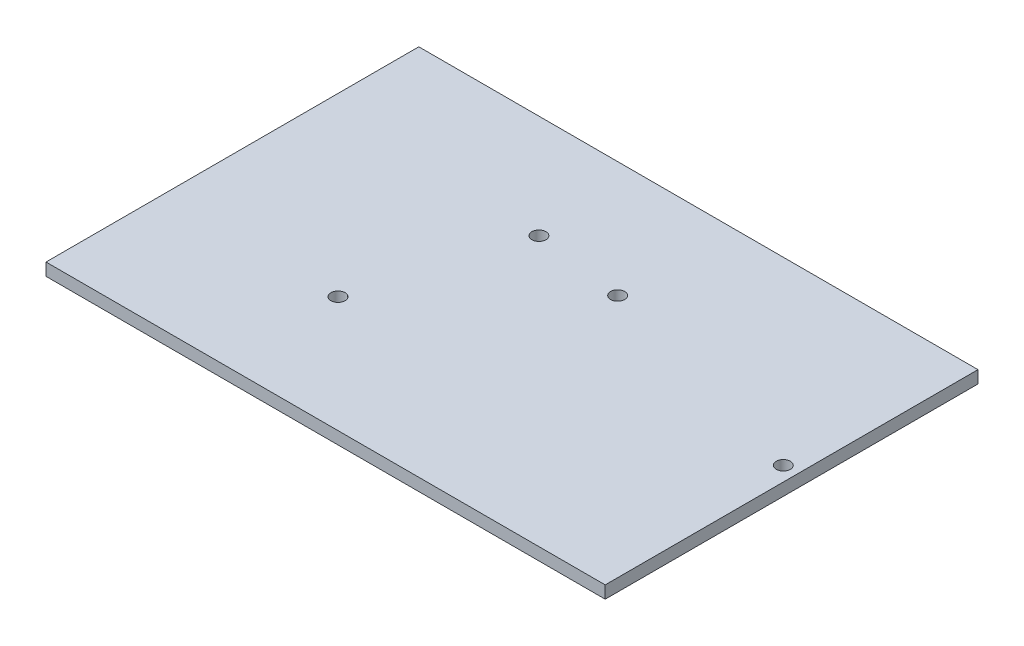
ISO-10303-21;
HEADER;
FILE_DESCRIPTION(('STEP AP214'),'2;1');
FILE_NAME('part.step','',(''),(''),'','','');
FILE_SCHEMA(('AUTOMOTIVE_DESIGN { 1 0 10303 214 1 1 1 1 }'));
ENDSEC;
DATA;
#1=APPLICATION_CONTEXT('core data for automotive mechanical design processes');
#2=APPLICATION_PROTOCOL_DEFINITION('international standard','automotive_design',2000,#1);
#3=PRODUCT_CONTEXT('',#1,'mechanical');
#4=PRODUCT('Part','Part','',(#3));
#5=PRODUCT_RELATED_PRODUCT_CATEGORY('part','',(#4));
#6=PRODUCT_DEFINITION_FORMATION('','',#4);
#7=PRODUCT_DEFINITION_CONTEXT('part definition',#1,'design');
#8=PRODUCT_DEFINITION('design','',#6,#7);
#9=PRODUCT_DEFINITION_SHAPE('','',#8);
#10=(LENGTH_UNIT() NAMED_UNIT(*) SI_UNIT(.MILLI.,.METRE.));
#11=(NAMED_UNIT(*) PLANE_ANGLE_UNIT() SI_UNIT($,.RADIAN.));
#12=(NAMED_UNIT(*) SI_UNIT($,.STERADIAN.) SOLID_ANGLE_UNIT());
#13=UNCERTAINTY_MEASURE_WITH_UNIT(LENGTH_MEASURE(1.E-05),#10,'distance_accuracy_value','');
#14=(GEOMETRIC_REPRESENTATION_CONTEXT(3) GLOBAL_UNCERTAINTY_ASSIGNED_CONTEXT((#13)) GLOBAL_UNIT_ASSIGNED_CONTEXT((#10,
#11,#12)) REPRESENTATION_CONTEXT('',''));
#15=CARTESIAN_POINT('',(0.,0.,0.));
#16=DIRECTION('',(0.,0.,1.));
#17=DIRECTION('',(1.,0.,0.));
#18=AXIS2_PLACEMENT_3D('',#15,#16,#17);
#19=CARTESIAN_POINT('',(-67.5,3.,45.));
#20=DIRECTION('',(1.,0.,0.));
#21=DIRECTION('',(0.,0.,-1.));
#22=AXIS2_PLACEMENT_3D('',#19,#20,#21);
#23=PLANE('',#22);
#24=DIRECTION('',(0.,0.,1.));
#25=VECTOR('',#24,1.);
#26=CARTESIAN_POINT('',(-67.5,0.,45.));
#27=LINE('',#26,#25);
#28=CARTESIAN_POINT('',(-67.5,0.,-45.));
#29=VERTEX_POINT('',#28);
#30=CARTESIAN_POINT('',(-67.5,0.,45.));
#31=VERTEX_POINT('',#30);
#32=EDGE_CURVE('E102',#29,#31,#27,.T.);
#33=ORIENTED_EDGE('',*,*,#32,.T.);
#34=DIRECTION('',(0.,-1.,0.));
#35=VECTOR('',#34,1.);
#36=CARTESIAN_POINT('',(-67.5,3.,45.));
#37=LINE('',#36,#35);
#38=CARTESIAN_POINT('',(-67.5,3.,45.));
#39=VERTEX_POINT('',#38);
#40=EDGE_CURVE('E11',#39,#31,#37,.T.);
#41=ORIENTED_EDGE('',*,*,#40,.F.);
#42=DIRECTION('',(0.,0.,1.));
#43=VECTOR('',#42,1.);
#44=CARTESIAN_POINT('',(-67.5,3.,45.));
#45=LINE('',#44,#43);
#46=CARTESIAN_POINT('',(-67.5,3.,-45.));
#47=VERTEX_POINT('',#46);
#48=EDGE_CURVE('E90',#47,#39,#45,.T.);
#49=ORIENTED_EDGE('',*,*,#48,.F.);
#50=DIRECTION('',(0.,-1.,0.));
#51=VECTOR('',#50,1.);
#52=CARTESIAN_POINT('',(-67.5,3.,-45.));
#53=LINE('',#52,#51);
#54=EDGE_CURVE('E98',#47,#29,#53,.T.);
#55=ORIENTED_EDGE('',*,*,#54,.T.);
#56=EDGE_LOOP('',(#33,#41,#49,#55));
#57=FACE_BOUND('',#56,.T.);
#58=ADVANCED_FACE('F39',(#57),#23,.F.);
#59=CARTESIAN_POINT('',(67.5,3.,45.));
#60=DIRECTION('',(0.,0.,-1.));
#61=DIRECTION('',(-1.,0.,0.));
#62=AXIS2_PLACEMENT_3D('',#59,#60,#61);
#63=PLANE('',#62);
#64=DIRECTION('',(1.,0.,0.));
#65=VECTOR('',#64,1.);
#66=CARTESIAN_POINT('',(67.5,0.,45.));
#67=LINE('',#66,#65);
#68=CARTESIAN_POINT('',(67.5,0.,45.));
#69=VERTEX_POINT('',#68);
#70=EDGE_CURVE('E94',#31,#69,#67,.T.);
#71=ORIENTED_EDGE('',*,*,#70,.T.);
#72=DIRECTION('',(0.,-1.,0.));
#73=VECTOR('',#72,1.);
#74=CARTESIAN_POINT('',(67.5,3.,45.));
#75=LINE('',#74,#73);
#76=CARTESIAN_POINT('',(67.5,3.,45.));
#77=VERTEX_POINT('',#76);
#78=EDGE_CURVE('E47',#77,#69,#75,.T.);
#79=ORIENTED_EDGE('',*,*,#78,.F.);
#80=DIRECTION('',(1.,0.,0.));
#81=VECTOR('',#80,1.);
#82=CARTESIAN_POINT('',(67.5,3.,45.));
#83=LINE('',#82,#81);
#84=EDGE_CURVE('E85',#39,#77,#83,.T.);
#85=ORIENTED_EDGE('',*,*,#84,.F.);
#86=ORIENTED_EDGE('',*,*,#40,.T.);
#87=EDGE_LOOP('',(#71,#79,#85,#86));
#88=FACE_BOUND('',#87,.T.);
#89=ADVANCED_FACE('F93',(#88),#63,.F.);
#90=CARTESIAN_POINT('',(67.5,3.,45.));
#91=DIRECTION('',(-1.,0.,0.));
#92=DIRECTION('',(0.,0.,1.));
#93=AXIS2_PLACEMENT_3D('',#90,#91,#92);
#94=PLANE('',#93);
#95=DIRECTION('',(0.,0.,-1.));
#96=VECTOR('',#95,1.);
#97=CARTESIAN_POINT('',(67.5,0.,45.));
#98=LINE('',#97,#96);
#99=CARTESIAN_POINT('',(67.5,0.,-45.));
#100=VERTEX_POINT('',#99);
#101=EDGE_CURVE('E72',#69,#100,#98,.T.);
#102=ORIENTED_EDGE('',*,*,#101,.T.);
#103=DIRECTION('',(0.,-1.,0.));
#104=VECTOR('',#103,1.);
#105=CARTESIAN_POINT('',(67.5,3.,-45.));
#106=LINE('',#105,#104);
#107=CARTESIAN_POINT('',(67.5,3.,-45.));
#108=VERTEX_POINT('',#107);
#109=EDGE_CURVE('E95',#108,#100,#106,.T.);
#110=ORIENTED_EDGE('',*,*,#109,.F.);
#111=DIRECTION('',(0.,0.,-1.));
#112=VECTOR('',#111,1.);
#113=CARTESIAN_POINT('',(67.5,3.,45.));
#114=LINE('',#113,#112);
#115=EDGE_CURVE('E88',#77,#108,#114,.T.);
#116=ORIENTED_EDGE('',*,*,#115,.F.);
#117=ORIENTED_EDGE('',*,*,#78,.T.);
#118=EDGE_LOOP('',(#102,#110,#116,#117));
#119=FACE_BOUND('',#118,.T.);
#120=ADVANCED_FACE('F96',(#119),#94,.F.);
#121=CARTESIAN_POINT('',(67.5,3.,-45.));
#122=DIRECTION('',(0.,0.,1.));
#123=DIRECTION('',(1.,0.,0.));
#124=AXIS2_PLACEMENT_3D('',#121,#122,#123);
#125=PLANE('',#124);
#126=DIRECTION('',(-1.,0.,0.));
#127=VECTOR('',#126,1.);
#128=CARTESIAN_POINT('',(67.5,0.,-45.));
#129=LINE('',#128,#127);
#130=EDGE_CURVE('E78',#100,#29,#129,.T.);
#131=ORIENTED_EDGE('',*,*,#130,.T.);
#132=ORIENTED_EDGE('',*,*,#54,.F.);
#133=DIRECTION('',(-1.,0.,0.));
#134=VECTOR('',#133,1.);
#135=CARTESIAN_POINT('',(67.5,3.,-45.));
#136=LINE('',#135,#134);
#137=EDGE_CURVE('E55',#108,#47,#136,.T.);
#138=ORIENTED_EDGE('',*,*,#137,.F.);
#139=ORIENTED_EDGE('',*,*,#109,.T.);
#140=EDGE_LOOP('',(#131,#132,#138,#139));
#141=FACE_BOUND('',#140,.T.);
#142=ADVANCED_FACE('F110',(#141),#125,.F.);
#143=CARTESIAN_POINT('',(0.,3.,0.));
#144=DIRECTION('',(0.,1.,0.));
#145=DIRECTION('',(0.,0.,1.));
#146=AXIS2_PLACEMENT_3D('',#143,#144,#145);
#147=PLANE('',#146);
#148=CARTESIAN_POINT('',(64.,3.,-1.50000000000004));
#149=DIRECTION('',(0.,1.,0.));
#150=DIRECTION('',(0.,0.,1.));
#151=AXIS2_PLACEMENT_3D('',#148,#149,#150);
#152=CIRCLE('',#151,1.7);
#153=CARTESIAN_POINT('',(64.,3.,0.199999999999963));
#154=VERTEX_POINT('',#153);
#155=EDGE_CURVE('E125',#154,#154,#152,.T.);
#156=ORIENTED_EDGE('',*,*,#155,.F.);
#157=EDGE_LOOP('',(#156));
#158=FACE_BOUND('',#157,.T.);
#159=CARTESIAN_POINT('',(-25.,3.,17.));
#160=DIRECTION('',(0.,1.,0.));
#161=DIRECTION('',(0.,0.,1.));
#162=AXIS2_PLACEMENT_3D('',#159,#160,#161);
#163=CIRCLE('',#162,1.7);
#164=CARTESIAN_POINT('',(-25.,3.,18.7));
#165=VERTEX_POINT('',#164);
#166=EDGE_CURVE('E131',#165,#165,#163,.T.);
#167=ORIENTED_EDGE('',*,*,#166,.F.);
#168=EDGE_LOOP('',(#167));
#169=FACE_BOUND('',#168,.T.);
#170=CARTESIAN_POINT('',(8.49999999999997,3.,-17.));
#171=DIRECTION('',(0.,1.,0.));
#172=DIRECTION('',(0.,0.,1.));
#173=AXIS2_PLACEMENT_3D('',#170,#171,#172);
#174=CIRCLE('',#173,1.7);
#175=CARTESIAN_POINT('',(8.49999999999997,3.,-15.3));
#176=VERTEX_POINT('',#175);
#177=EDGE_CURVE('E119',#176,#176,#174,.T.);
#178=ORIENTED_EDGE('',*,*,#177,.F.);
#179=EDGE_LOOP('',(#178));
#180=FACE_BOUND('',#179,.T.);
#181=CARTESIAN_POINT('',(-13.5,3.,-20.));
#182=DIRECTION('',(0.,1.,0.));
#183=DIRECTION('',(0.,0.,1.));
#184=AXIS2_PLACEMENT_3D('',#181,#182,#183);
#185=CIRCLE('',#184,1.7);
#186=CARTESIAN_POINT('',(-13.5,3.,-18.3));
#187=VERTEX_POINT('',#186);
#188=EDGE_CURVE('E116',#187,#187,#185,.T.);
#189=ORIENTED_EDGE('',*,*,#188,.F.);
#190=EDGE_LOOP('',(#189));
#191=FACE_BOUND('',#190,.T.);
#192=ORIENTED_EDGE('',*,*,#48,.T.);
#193=ORIENTED_EDGE('',*,*,#84,.T.);
#194=ORIENTED_EDGE('',*,*,#115,.T.);
#195=ORIENTED_EDGE('',*,*,#137,.T.);
#196=EDGE_LOOP('',(#192,#193,#194,#195));
#197=FACE_BOUND('',#196,.T.);
#198=ADVANCED_FACE('F86',(#158,#169,#180,#191,#197),#147,.T.);
#199=CARTESIAN_POINT('',(0.,0.,0.));
#200=DIRECTION('',(0.,1.,0.));
#201=DIRECTION('',(0.,0.,1.));
#202=AXIS2_PLACEMENT_3D('',#199,#200,#201);
#203=PLANE('',#202);
#204=CARTESIAN_POINT('',(64.,0.,-1.50000000000004));
#205=DIRECTION('',(0.,1.,0.));
#206=DIRECTION('',(0.,0.,1.));
#207=AXIS2_PLACEMENT_3D('',#204,#205,#206);
#208=CIRCLE('',#207,1.7);
#209=CARTESIAN_POINT('',(64.,0.,0.199999999999963));
#210=VERTEX_POINT('',#209);
#211=EDGE_CURVE('E122',#210,#210,#208,.T.);
#212=ORIENTED_EDGE('',*,*,#211,.T.);
#213=EDGE_LOOP('',(#212));
#214=FACE_BOUND('',#213,.T.);
#215=CARTESIAN_POINT('',(-25.,0.,17.));
#216=DIRECTION('',(0.,1.,0.));
#217=DIRECTION('',(0.,0.,1.));
#218=AXIS2_PLACEMENT_3D('',#215,#216,#217);
#219=CIRCLE('',#218,1.7);
#220=CARTESIAN_POINT('',(-25.,0.,18.7));
#221=VERTEX_POINT('',#220);
#222=EDGE_CURVE('E128',#221,#221,#219,.T.);
#223=ORIENTED_EDGE('',*,*,#222,.T.);
#224=EDGE_LOOP('',(#223));
#225=FACE_BOUND('',#224,.T.);
#226=CARTESIAN_POINT('',(8.49999999999997,0.,-17.));
#227=DIRECTION('',(0.,1.,0.));
#228=DIRECTION('',(0.,0.,1.));
#229=AXIS2_PLACEMENT_3D('',#226,#227,#228);
#230=CIRCLE('',#229,1.7);
#231=CARTESIAN_POINT('',(8.49999999999997,0.,-15.3));
#232=VERTEX_POINT('',#231);
#233=EDGE_CURVE('E134',#232,#232,#230,.T.);
#234=ORIENTED_EDGE('',*,*,#233,.T.);
#235=EDGE_LOOP('',(#234));
#236=FACE_BOUND('',#235,.T.);
#237=CARTESIAN_POINT('',(-13.5,0.,-20.));
#238=DIRECTION('',(0.,1.,0.));
#239=DIRECTION('',(0.,0.,1.));
#240=AXIS2_PLACEMENT_3D('',#237,#238,#239);
#241=CIRCLE('',#240,1.7);
#242=CARTESIAN_POINT('',(-13.5,0.,-18.3));
#243=VERTEX_POINT('',#242);
#244=EDGE_CURVE('E105',#243,#243,#241,.T.);
#245=ORIENTED_EDGE('',*,*,#244,.T.);
#246=EDGE_LOOP('',(#245));
#247=FACE_BOUND('',#246,.T.);
#248=ORIENTED_EDGE('',*,*,#32,.F.);
#249=ORIENTED_EDGE('',*,*,#130,.F.);
#250=ORIENTED_EDGE('',*,*,#101,.F.);
#251=ORIENTED_EDGE('',*,*,#70,.F.);
#252=EDGE_LOOP('',(#248,#249,#250,#251));
#253=FACE_BOUND('',#252,.T.);
#254=ADVANCED_FACE('F113',(#214,#225,#236,#247,#253),#203,.F.);
#255=CARTESIAN_POINT('',(-13.5,0.,-20.));
#256=DIRECTION('',(0.,1.,0.));
#257=DIRECTION('',(0.,0.,1.));
#258=AXIS2_PLACEMENT_3D('',#255,#256,#257);
#259=CYLINDRICAL_SURFACE('',#258,1.7);
#260=ORIENTED_EDGE('',*,*,#244,.F.);
#261=EDGE_LOOP('',(#260));
#262=FACE_BOUND('',#261,.T.);
#263=ORIENTED_EDGE('',*,*,#188,.T.);
#264=EDGE_LOOP('',(#263));
#265=FACE_BOUND('',#264,.T.);
#266=ADVANCED_FACE('F148',(#262,#265),#259,.F.);
#267=CARTESIAN_POINT('',(8.49999999999997,0.,-17.));
#268=DIRECTION('',(0.,1.,0.));
#269=DIRECTION('',(0.,0.,1.));
#270=AXIS2_PLACEMENT_3D('',#267,#268,#269);
#271=CYLINDRICAL_SURFACE('',#270,1.7);
#272=ORIENTED_EDGE('',*,*,#233,.F.);
#273=EDGE_LOOP('',(#272));
#274=FACE_BOUND('',#273,.T.);
#275=ORIENTED_EDGE('',*,*,#177,.T.);
#276=EDGE_LOOP('',(#275));
#277=FACE_BOUND('',#276,.T.);
#278=ADVANCED_FACE('F140',(#274,#277),#271,.F.);
#279=CARTESIAN_POINT('',(-25.,0.,17.));
#280=DIRECTION('',(0.,1.,0.));
#281=DIRECTION('',(0.,0.,1.));
#282=AXIS2_PLACEMENT_3D('',#279,#280,#281);
#283=CYLINDRICAL_SURFACE('',#282,1.7);
#284=ORIENTED_EDGE('',*,*,#222,.F.);
#285=EDGE_LOOP('',(#284));
#286=FACE_BOUND('',#285,.T.);
#287=ORIENTED_EDGE('',*,*,#166,.T.);
#288=EDGE_LOOP('',(#287));
#289=FACE_BOUND('',#288,.T.);
#290=ADVANCED_FACE('F156',(#286,#289),#283,.F.);
#291=CARTESIAN_POINT('',(64.,0.,-1.50000000000004));
#292=DIRECTION('',(0.,1.,0.));
#293=DIRECTION('',(0.,0.,1.));
#294=AXIS2_PLACEMENT_3D('',#291,#292,#293);
#295=CYLINDRICAL_SURFACE('',#294,1.7);
#296=ORIENTED_EDGE('',*,*,#211,.F.);
#297=EDGE_LOOP('',(#296));
#298=FACE_BOUND('',#297,.T.);
#299=ORIENTED_EDGE('',*,*,#155,.T.);
#300=EDGE_LOOP('',(#299));
#301=FACE_BOUND('',#300,.T.);
#302=ADVANCED_FACE('F207',(#298,#301),#295,.F.);
#303=CLOSED_SHELL('',(#58,#89,#120,#142,#198,#254,#266,#278,#290,#302));
#304=MANIFOLD_SOLID_BREP('B2',#303);
#305=ADVANCED_BREP_SHAPE_REPRESENTATION('',(#18,#304),#14);
#306=SHAPE_DEFINITION_REPRESENTATION(#9,#305);
ENDSEC;
END-ISO-10303-21;
